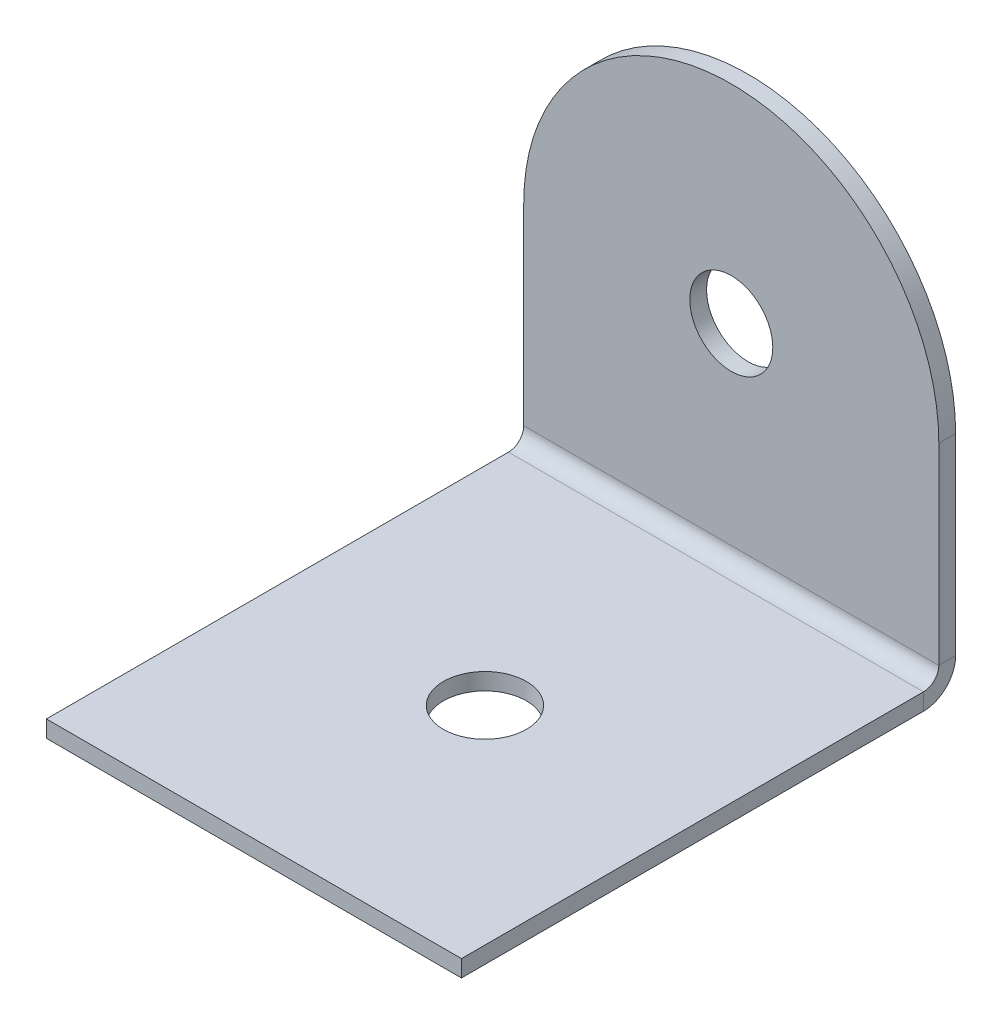
ISO-10303-21;
HEADER;
FILE_DESCRIPTION(('STEP AP214'),'2;1');
FILE_NAME('part.step','',(''),(''),'','','');
FILE_SCHEMA(('AUTOMOTIVE_DESIGN { 1 0 10303 214 1 1 1 1 }'));
ENDSEC;
DATA;
#1=APPLICATION_CONTEXT('core data for automotive mechanical design processes');
#2=APPLICATION_PROTOCOL_DEFINITION('international standard','automotive_design',2000,#1);
#3=PRODUCT_CONTEXT('',#1,'mechanical');
#4=PRODUCT('Part','Part','',(#3));
#5=PRODUCT_RELATED_PRODUCT_CATEGORY('part','',(#4));
#6=PRODUCT_DEFINITION_FORMATION('','',#4);
#7=PRODUCT_DEFINITION_CONTEXT('part definition',#1,'design');
#8=PRODUCT_DEFINITION('design','',#6,#7);
#9=PRODUCT_DEFINITION_SHAPE('','',#8);
#10=(LENGTH_UNIT() NAMED_UNIT(*) SI_UNIT(.MILLI.,.METRE.));
#11=(NAMED_UNIT(*) PLANE_ANGLE_UNIT() SI_UNIT($,.RADIAN.));
#12=(NAMED_UNIT(*) SI_UNIT($,.STERADIAN.) SOLID_ANGLE_UNIT());
#13=UNCERTAINTY_MEASURE_WITH_UNIT(LENGTH_MEASURE(1.E-05),#10,'distance_accuracy_value','');
#14=(GEOMETRIC_REPRESENTATION_CONTEXT(3) GLOBAL_UNCERTAINTY_ASSIGNED_CONTEXT((#13)) GLOBAL_UNIT_ASSIGNED_CONTEXT((#10,
#11,#12)) REPRESENTATION_CONTEXT('',''));
#15=CARTESIAN_POINT('',(0.,0.,0.));
#16=DIRECTION('',(0.,0.,1.));
#17=DIRECTION('',(1.,0.,0.));
#18=AXIS2_PLACEMENT_3D('',#15,#16,#17);
#19=CARTESIAN_POINT('',(20.,0.,-0.81));
#20=DIRECTION('',(1.,0.,0.));
#21=DIRECTION('',(0.,1.,0.));
#22=AXIS2_PLACEMENT_3D('',#19,#20,#21);
#23=PLANE('',#22);
#24=DIRECTION('',(0.,1.,0.));
#25=VECTOR('',#24,1.);
#26=CARTESIAN_POINT('',(20.,0.,0.));
#27=LINE('',#26,#25);
#28=CARTESIAN_POINT('',(20.,0.736599999999997,0.));
#29=VERTEX_POINT('',#28);
#30=CARTESIAN_POINT('',(20.,10.,0.));
#31=VERTEX_POINT('',#30);
#32=EDGE_CURVE('E83',#29,#31,#27,.T.);
#33=ORIENTED_EDGE('',*,*,#32,.F.);
#34=DIRECTION('',(0.,0.,-1.));
#35=VECTOR('',#34,1.);
#36=CARTESIAN_POINT('',(20.,0.736599999999997,0.));
#37=LINE('',#36,#35);
#38=CARTESIAN_POINT('',(20.,0.736599999999997,-0.809999999999999));
#39=VERTEX_POINT('',#38);
#40=EDGE_CURVE('E96',#29,#39,#37,.T.);
#41=ORIENTED_EDGE('',*,*,#40,.T.);
#42=DIRECTION('',(0.,1.,0.));
#43=VECTOR('',#42,1.);
#44=CARTESIAN_POINT('',(20.,0.,-0.81));
#45=LINE('',#44,#43);
#46=CARTESIAN_POINT('',(20.,10.,-0.81));
#47=VERTEX_POINT('',#46);
#48=EDGE_CURVE('E90',#39,#47,#45,.T.);
#49=ORIENTED_EDGE('',*,*,#48,.T.);
#50=DIRECTION('',(0.,0.,1.));
#51=VECTOR('',#50,1.);
#52=CARTESIAN_POINT('',(20.,10.,-0.81));
#53=LINE('',#52,#51);
#54=EDGE_CURVE('E39',#47,#31,#53,.T.);
#55=ORIENTED_EDGE('',*,*,#54,.T.);
#56=EDGE_LOOP('',(#33,#41,#49,#55));
#57=FACE_BOUND('',#56,.T.);
#58=ADVANCED_FACE('F35',(#57),#23,.T.);
#59=CARTESIAN_POINT('',(10.,10.,-0.81));
#60=DIRECTION('',(0.,0.,-1.));
#61=DIRECTION('',(-1.,0.,0.));
#62=AXIS2_PLACEMENT_3D('',#59,#60,#61);
#63=PLANE('',#62);
#64=CARTESIAN_POINT('',(10.,10.,-0.81));
#65=DIRECTION('',(0.,0.,-1.));
#66=DIRECTION('',(-1.,0.,0.));
#67=AXIS2_PLACEMENT_3D('',#64,#65,#66);
#68=CIRCLE('',#67,2.);
#69=CARTESIAN_POINT('',(8.,10.,-0.81));
#70=VERTEX_POINT('',#69);
#71=EDGE_CURVE('E152',#70,#70,#68,.F.);
#72=ORIENTED_EDGE('',*,*,#71,.T.);
#73=EDGE_LOOP('',(#72));
#74=FACE_BOUND('',#73,.T.);
#75=ORIENTED_EDGE('',*,*,#48,.F.);
#76=DIRECTION('',(1.,0.,0.));
#77=VECTOR('',#76,1.);
#78=CARTESIAN_POINT('',(20.,0.736599999999997,-0.809999999999999));
#79=LINE('',#78,#77);
#80=CARTESIAN_POINT('',(0.,0.736600000000002,-0.81));
#81=VERTEX_POINT('',#80);
#82=EDGE_CURVE('E113',#39,#81,#79,.F.);
#83=ORIENTED_EDGE('',*,*,#82,.T.);
#84=DIRECTION('',(0.,-1.,0.));
#85=VECTOR('',#84,1.);
#86=CARTESIAN_POINT('',(0.,0.,-0.81));
#87=LINE('',#86,#85);
#88=CARTESIAN_POINT('',(0.,10.,-0.81));
#89=VERTEX_POINT('',#88);
#90=EDGE_CURVE('E88',#89,#81,#87,.T.);
#91=ORIENTED_EDGE('',*,*,#90,.F.);
#92=CARTESIAN_POINT('',(10.,10.,-0.81));
#93=DIRECTION('',(0.,0.,1.));
#94=DIRECTION('',(-1.,0.,0.));
#95=AXIS2_PLACEMENT_3D('',#92,#93,#94);
#96=CIRCLE('',#95,10.);
#97=EDGE_CURVE('E75',#47,#89,#96,.T.);
#98=ORIENTED_EDGE('',*,*,#97,.F.);
#99=EDGE_LOOP('',(#75,#83,#91,#98));
#100=FACE_BOUND('',#99,.T.);
#101=ADVANCED_FACE('F219',(#74,#100),#63,.T.);
#102=CARTESIAN_POINT('',(10.,10.,0.));
#103=DIRECTION('',(0.,0.,-1.));
#104=DIRECTION('',(-1.,0.,0.));
#105=AXIS2_PLACEMENT_3D('',#102,#103,#104);
#106=PLANE('',#105);
#107=CARTESIAN_POINT('',(10.,10.,0.));
#108=DIRECTION('',(0.,0.,1.));
#109=DIRECTION('',(1.,0.,0.));
#110=AXIS2_PLACEMENT_3D('',#107,#108,#109);
#111=CIRCLE('',#110,2.);
#112=CARTESIAN_POINT('',(12.,10.,0.));
#113=VERTEX_POINT('',#112);
#114=EDGE_CURVE('E147',#113,#113,#111,.T.);
#115=ORIENTED_EDGE('',*,*,#114,.F.);
#116=EDGE_LOOP('',(#115));
#117=FACE_BOUND('',#116,.T.);
#118=DIRECTION('',(1.,0.,0.));
#119=VECTOR('',#118,1.);
#120=CARTESIAN_POINT('',(20.,0.736599999999997,0.));
#121=LINE('',#120,#119);
#122=CARTESIAN_POINT('',(0.,0.736599999999996,0.));
#123=VERTEX_POINT('',#122);
#124=EDGE_CURVE('E103',#29,#123,#121,.F.);
#125=ORIENTED_EDGE('',*,*,#124,.F.);
#126=ORIENTED_EDGE('',*,*,#32,.T.);
#127=CARTESIAN_POINT('',(10.,10.,0.));
#128=DIRECTION('',(0.,0.,1.));
#129=DIRECTION('',(-1.,0.,0.));
#130=AXIS2_PLACEMENT_3D('',#127,#128,#129);
#131=CIRCLE('',#130,10.);
#132=CARTESIAN_POINT('',(0.,10.,0.));
#133=VERTEX_POINT('',#132);
#134=EDGE_CURVE('E73',#31,#133,#131,.T.);
#135=ORIENTED_EDGE('',*,*,#134,.T.);
#136=DIRECTION('',(0.,-1.,0.));
#137=VECTOR('',#136,1.);
#138=CARTESIAN_POINT('',(0.,0.,0.));
#139=LINE('',#138,#137);
#140=EDGE_CURVE('E78',#133,#123,#139,.T.);
#141=ORIENTED_EDGE('',*,*,#140,.T.);
#142=EDGE_LOOP('',(#125,#126,#135,#141));
#143=FACE_BOUND('',#142,.T.);
#144=ADVANCED_FACE('F85',(#117,#143),#106,.F.);
#145=CARTESIAN_POINT('',(0.,0.,-0.81));
#146=DIRECTION('',(-1.,0.,0.));
#147=DIRECTION('',(0.,0.,1.));
#148=AXIS2_PLACEMENT_3D('',#145,#146,#147);
#149=PLANE('',#148);
#150=DIRECTION('',(0.,0.,-1.));
#151=VECTOR('',#150,1.);
#152=CARTESIAN_POINT('',(0.,0.736599999999996,0.));
#153=LINE('',#152,#151);
#154=EDGE_CURVE('E80',#123,#81,#153,.T.);
#155=ORIENTED_EDGE('',*,*,#154,.F.);
#156=ORIENTED_EDGE('',*,*,#140,.F.);
#157=DIRECTION('',(0.,0.,1.));
#158=VECTOR('',#157,1.);
#159=CARTESIAN_POINT('',(0.,10.,-0.81));
#160=LINE('',#159,#158);
#161=EDGE_CURVE('E11',#89,#133,#160,.T.);
#162=ORIENTED_EDGE('',*,*,#161,.F.);
#163=ORIENTED_EDGE('',*,*,#90,.T.);
#164=EDGE_LOOP('',(#155,#156,#162,#163));
#165=FACE_BOUND('',#164,.T.);
#166=ADVANCED_FACE('F37',(#165),#149,.T.);
#167=CARTESIAN_POINT('',(10.,10.,-0.81));
#168=DIRECTION('',(0.,0.,1.));
#169=DIRECTION('',(1.,0.,0.));
#170=AXIS2_PLACEMENT_3D('',#167,#168,#169);
#171=CYLINDRICAL_SURFACE('',#170,10.);
#172=ORIENTED_EDGE('',*,*,#134,.F.);
#173=ORIENTED_EDGE('',*,*,#54,.F.);
#174=ORIENTED_EDGE('',*,*,#97,.T.);
#175=ORIENTED_EDGE('',*,*,#161,.T.);
#176=EDGE_LOOP('',(#172,#173,#174,#175));
#177=FACE_BOUND('',#176,.T.);
#178=ADVANCED_FACE('F70',(#177),#171,.T.);
#179=CARTESIAN_POINT('',(0.,0.736599999999997,0.7366));
#180=DIRECTION('',(-1.,0.,0.));
#181=DIRECTION('',(0.,-1.,0.));
#182=AXIS2_PLACEMENT_3D('',#179,#180,#181);
#183=PLANE('',#182);
#184=DIRECTION('',(0.,-1.,0.));
#185=VECTOR('',#184,1.);
#186=CARTESIAN_POINT('',(0.,0.,0.736599999999997));
#187=LINE('',#186,#185);
#188=CARTESIAN_POINT('',(0.,0.,0.736599999999997));
#189=VERTEX_POINT('',#188);
#190=CARTESIAN_POINT('',(0.,-0.810000000000003,0.736599999999995));
#191=VERTEX_POINT('',#190);
#192=EDGE_CURVE('E143',#189,#191,#187,.T.);
#193=ORIENTED_EDGE('',*,*,#192,.F.);
#194=CARTESIAN_POINT('',(0.,0.736599999999997,0.7366));
#195=DIRECTION('',(1.,0.,0.));
#196=DIRECTION('',(0.,1.,0.));
#197=AXIS2_PLACEMENT_3D('',#194,#195,#196);
#198=CIRCLE('',#197,0.736599999999999);
#199=EDGE_CURVE('E107',#123,#189,#198,.F.);
#200=ORIENTED_EDGE('',*,*,#199,.F.);
#201=ORIENTED_EDGE('',*,*,#154,.T.);
#202=CARTESIAN_POINT('',(0.,0.736599999999997,0.7366));
#203=DIRECTION('',(1.,0.,0.));
#204=DIRECTION('',(0.,1.,0.));
#205=AXIS2_PLACEMENT_3D('',#202,#203,#204);
#206=CIRCLE('',#205,1.5466);
#207=EDGE_CURVE('E50',#81,#191,#206,.F.);
#208=ORIENTED_EDGE('',*,*,#207,.T.);
#209=EDGE_LOOP('',(#193,#200,#201,#208));
#210=FACE_BOUND('',#209,.T.);
#211=ADVANCED_FACE('F222',(#210),#183,.T.);
#212=CARTESIAN_POINT('',(20.,0.736599999999998,0.7366));
#213=DIRECTION('',(-1.,0.,0.));
#214=DIRECTION('',(0.,-1.,0.));
#215=AXIS2_PLACEMENT_3D('',#212,#213,#214);
#216=PLANE('',#215);
#217=CARTESIAN_POINT('',(20.,0.736599999999998,0.7366));
#218=DIRECTION('',(1.,0.,0.));
#219=DIRECTION('',(0.,1.,0.));
#220=AXIS2_PLACEMENT_3D('',#217,#218,#219);
#221=CIRCLE('',#220,0.736599999999999);
#222=CARTESIAN_POINT('',(20.,0.,0.736599999999997));
#223=VERTEX_POINT('',#222);
#224=EDGE_CURVE('E100',#223,#29,#221,.T.);
#225=ORIENTED_EDGE('',*,*,#224,.F.);
#226=DIRECTION('',(0.,-1.,0.));
#227=VECTOR('',#226,1.);
#228=CARTESIAN_POINT('',(20.,0.,0.736599999999997));
#229=LINE('',#228,#227);
#230=CARTESIAN_POINT('',(20.,-0.810000000000003,0.736599999999995));
#231=VERTEX_POINT('',#230);
#232=EDGE_CURVE('E142',#223,#231,#229,.T.);
#233=ORIENTED_EDGE('',*,*,#232,.T.);
#234=CARTESIAN_POINT('',(20.,0.736599999999998,0.7366));
#235=DIRECTION('',(1.,0.,0.));
#236=DIRECTION('',(0.,1.,0.));
#237=AXIS2_PLACEMENT_3D('',#234,#235,#236);
#238=CIRCLE('',#237,1.5466);
#239=EDGE_CURVE('E110',#231,#39,#238,.T.);
#240=ORIENTED_EDGE('',*,*,#239,.T.);
#241=ORIENTED_EDGE('',*,*,#40,.F.);
#242=EDGE_LOOP('',(#225,#233,#240,#241));
#243=FACE_BOUND('',#242,.T.);
#244=ADVANCED_FACE('F211',(#243),#216,.F.);
#245=CARTESIAN_POINT('',(20.,0.736599999999998,0.7366));
#246=DIRECTION('',(1.,0.,0.));
#247=DIRECTION('',(0.,-1.,0.));
#248=AXIS2_PLACEMENT_3D('',#245,#246,#247);
#249=CYLINDRICAL_SURFACE('',#248,1.5466);
#250=ORIENTED_EDGE('',*,*,#82,.F.);
#251=ORIENTED_EDGE('',*,*,#239,.F.);
#252=DIRECTION('',(-1.,0.,0.));
#253=VECTOR('',#252,1.);
#254=CARTESIAN_POINT('',(0.,-0.810000000000003,0.736599999999995));
#255=LINE('',#254,#253);
#256=EDGE_CURVE('E133',#231,#191,#255,.T.);
#257=ORIENTED_EDGE('',*,*,#256,.T.);
#258=ORIENTED_EDGE('',*,*,#207,.F.);
#259=EDGE_LOOP('',(#250,#251,#257,#258));
#260=FACE_BOUND('',#259,.T.);
#261=ADVANCED_FACE('F220',(#260),#249,.T.);
#262=CARTESIAN_POINT('',(20.,0.736599999999998,0.7366));
#263=DIRECTION('',(1.,0.,0.));
#264=DIRECTION('',(0.,-1.,0.));
#265=AXIS2_PLACEMENT_3D('',#262,#263,#264);
#266=CYLINDRICAL_SURFACE('',#265,0.736599999999999);
#267=ORIENTED_EDGE('',*,*,#124,.T.);
#268=ORIENTED_EDGE('',*,*,#199,.T.);
#269=DIRECTION('',(1.,0.,0.));
#270=VECTOR('',#269,1.);
#271=CARTESIAN_POINT('',(0.,0.,0.736599999999997));
#272=LINE('',#271,#270);
#273=EDGE_CURVE('E146',#189,#223,#272,.T.);
#274=ORIENTED_EDGE('',*,*,#273,.T.);
#275=ORIENTED_EDGE('',*,*,#224,.T.);
#276=EDGE_LOOP('',(#267,#268,#274,#275));
#277=FACE_BOUND('',#276,.T.);
#278=ADVANCED_FACE('F216',(#277),#266,.F.);
#279=CARTESIAN_POINT('',(0.,-0.81,0.));
#280=DIRECTION('',(1.,0.,0.));
#281=DIRECTION('',(0.,0.,-1.));
#282=AXIS2_PLACEMENT_3D('',#279,#280,#281);
#283=PLANE('',#282);
#284=ORIENTED_EDGE('',*,*,#192,.T.);
#285=DIRECTION('',(0.,0.,-1.));
#286=VECTOR('',#285,1.);
#287=CARTESIAN_POINT('',(0.,-0.81,0.));
#288=LINE('',#287,#286);
#289=CARTESIAN_POINT('',(0.,-0.81000000000008,23.));
#290=VERTEX_POINT('',#289);
#291=EDGE_CURVE('E126',#290,#191,#288,.T.);
#292=ORIENTED_EDGE('',*,*,#291,.F.);
#293=DIRECTION('',(0.,1.,0.));
#294=VECTOR('',#293,1.);
#295=CARTESIAN_POINT('',(0.,-0.81000000000008,23.));
#296=LINE('',#295,#294);
#297=CARTESIAN_POINT('',(0.,0.,23.));
#298=VERTEX_POINT('',#297);
#299=EDGE_CURVE('E119',#290,#298,#296,.T.);
#300=ORIENTED_EDGE('',*,*,#299,.T.);
#301=DIRECTION('',(0.,0.,-1.));
#302=VECTOR('',#301,1.);
#303=CARTESIAN_POINT('',(0.,0.,0.));
#304=LINE('',#303,#302);
#305=EDGE_CURVE('E130',#298,#189,#304,.T.);
#306=ORIENTED_EDGE('',*,*,#305,.T.);
#307=EDGE_LOOP('',(#284,#292,#300,#306));
#308=FACE_BOUND('',#307,.T.);
#309=ADVANCED_FACE('F224',(#308),#283,.F.);
#310=CARTESIAN_POINT('',(20.,-0.81000000000008,23.));
#311=DIRECTION('',(-1.,0.,0.));
#312=DIRECTION('',(0.,0.,1.));
#313=AXIS2_PLACEMENT_3D('',#310,#311,#312);
#314=PLANE('',#313);
#315=ORIENTED_EDGE('',*,*,#232,.F.);
#316=DIRECTION('',(0.,0.,1.));
#317=VECTOR('',#316,1.);
#318=CARTESIAN_POINT('',(20.,0.,23.));
#319=LINE('',#318,#317);
#320=CARTESIAN_POINT('',(20.,0.,23.));
#321=VERTEX_POINT('',#320);
#322=EDGE_CURVE('E127',#223,#321,#319,.T.);
#323=ORIENTED_EDGE('',*,*,#322,.T.);
#324=DIRECTION('',(0.,1.,0.));
#325=VECTOR('',#324,1.);
#326=CARTESIAN_POINT('',(20.,-0.81000000000008,23.));
#327=LINE('',#326,#325);
#328=CARTESIAN_POINT('',(20.,-0.81000000000008,23.));
#329=VERTEX_POINT('',#328);
#330=EDGE_CURVE('E104',#329,#321,#327,.T.);
#331=ORIENTED_EDGE('',*,*,#330,.F.);
#332=DIRECTION('',(0.,0.,1.));
#333=VECTOR('',#332,1.);
#334=CARTESIAN_POINT('',(20.,-0.81000000000008,23.));
#335=LINE('',#334,#333);
#336=EDGE_CURVE('E136',#231,#329,#335,.T.);
#337=ORIENTED_EDGE('',*,*,#336,.F.);
#338=EDGE_LOOP('',(#315,#323,#331,#337));
#339=FACE_BOUND('',#338,.T.);
#340=ADVANCED_FACE('F184',(#339),#314,.F.);
#341=CARTESIAN_POINT('',(0.,-0.81,0.));
#342=DIRECTION('',(0.,1.,0.));
#343=DIRECTION('',(0.,0.,1.));
#344=AXIS2_PLACEMENT_3D('',#341,#342,#343);
#345=PLANE('',#344);
#346=CARTESIAN_POINT('',(10.,-0.810000000000041,11.87));
#347=DIRECTION('',(0.,1.,0.));
#348=DIRECTION('',(0.,0.,1.));
#349=AXIS2_PLACEMENT_3D('',#346,#347,#348);
#350=CIRCLE('',#349,2.);
#351=CARTESIAN_POINT('',(10.,-0.810000000000048,13.87));
#352=VERTEX_POINT('',#351);
#353=EDGE_CURVE('E155',#352,#352,#350,.F.);
#354=ORIENTED_EDGE('',*,*,#353,.F.);
#355=EDGE_LOOP('',(#354));
#356=FACE_BOUND('',#355,.T.);
#357=ORIENTED_EDGE('',*,*,#256,.F.);
#358=ORIENTED_EDGE('',*,*,#336,.T.);
#359=DIRECTION('',(-1.,0.,0.));
#360=VECTOR('',#359,1.);
#361=CARTESIAN_POINT('',(0.,-0.81000000000008,23.));
#362=LINE('',#361,#360);
#363=EDGE_CURVE('E122',#329,#290,#362,.T.);
#364=ORIENTED_EDGE('',*,*,#363,.T.);
#365=ORIENTED_EDGE('',*,*,#291,.T.);
#366=EDGE_LOOP('',(#357,#358,#364,#365));
#367=FACE_BOUND('',#366,.T.);
#368=ADVANCED_FACE('F171',(#356,#367),#345,.F.);
#369=CARTESIAN_POINT('',(0.,0.,0.));
#370=DIRECTION('',(0.,1.,0.));
#371=DIRECTION('',(0.,0.,1.));
#372=AXIS2_PLACEMENT_3D('',#369,#370,#371);
#373=PLANE('',#372);
#374=CARTESIAN_POINT('',(10.,0.,11.87));
#375=DIRECTION('',(0.,1.,0.));
#376=DIRECTION('',(0.,0.,1.));
#377=AXIS2_PLACEMENT_3D('',#374,#375,#376);
#378=CIRCLE('',#377,2.);
#379=CARTESIAN_POINT('',(10.,0.,13.87));
#380=VERTEX_POINT('',#379);
#381=EDGE_CURVE('E160',#380,#380,#378,.T.);
#382=ORIENTED_EDGE('',*,*,#381,.F.);
#383=EDGE_LOOP('',(#382));
#384=FACE_BOUND('',#383,.T.);
#385=ORIENTED_EDGE('',*,*,#322,.F.);
#386=ORIENTED_EDGE('',*,*,#273,.F.);
#387=ORIENTED_EDGE('',*,*,#305,.F.);
#388=DIRECTION('',(-1.,0.,0.));
#389=VECTOR('',#388,1.);
#390=CARTESIAN_POINT('',(0.,0.,23.));
#391=LINE('',#390,#389);
#392=EDGE_CURVE('E123',#321,#298,#391,.T.);
#393=ORIENTED_EDGE('',*,*,#392,.F.);
#394=EDGE_LOOP('',(#385,#386,#387,#393));
#395=FACE_BOUND('',#394,.T.);
#396=ADVANCED_FACE('F167',(#384,#395),#373,.T.);
#397=CARTESIAN_POINT('',(0.,-0.81000000000008,23.));
#398=DIRECTION('',(0.,0.,-1.));
#399=DIRECTION('',(0.,1.,0.));
#400=AXIS2_PLACEMENT_3D('',#397,#398,#399);
#401=PLANE('',#400);
#402=ORIENTED_EDGE('',*,*,#392,.T.);
#403=ORIENTED_EDGE('',*,*,#299,.F.);
#404=ORIENTED_EDGE('',*,*,#363,.F.);
#405=ORIENTED_EDGE('',*,*,#330,.T.);
#406=EDGE_LOOP('',(#402,#403,#404,#405));
#407=FACE_BOUND('',#406,.T.);
#408=ADVANCED_FACE('F170',(#407),#401,.F.);
#409=CARTESIAN_POINT('',(10.,10.,-0.811));
#410=DIRECTION('',(0.,0.,1.));
#411=DIRECTION('',(1.,0.,0.));
#412=AXIS2_PLACEMENT_3D('',#409,#410,#411);
#413=CYLINDRICAL_SURFACE('',#412,2.);
#414=ORIENTED_EDGE('',*,*,#71,.F.);
#415=EDGE_LOOP('',(#414));
#416=FACE_BOUND('',#415,.T.);
#417=ORIENTED_EDGE('',*,*,#114,.T.);
#418=EDGE_LOOP('',(#417));
#419=FACE_BOUND('',#418,.T.);
#420=ADVANCED_FACE('F282',(#416,#419),#413,.F.);
#421=CARTESIAN_POINT('',(10.,-0.811000000000125,11.87));
#422=DIRECTION('',(0.,1.,0.));
#423=DIRECTION('',(0.,0.,1.));
#424=AXIS2_PLACEMENT_3D('',#421,#422,#423);
#425=CYLINDRICAL_SURFACE('',#424,2.);
#426=CARTESIAN_POINT('',(10.,0.,13.87));
#427=CARTESIAN_POINT('',(10.,-0.00843750000004836,13.87));
#428=CARTESIAN_POINT('',(10.,-0.0168750000000484,13.87));
#429=CARTESIAN_POINT('',(10.,-0.0337500000000484,13.87));
#430=CARTESIAN_POINT('',(10.,-0.0421875000000484,13.87));
#431=CARTESIAN_POINT('',(10.,-0.0590625000000484,13.87));
#432=CARTESIAN_POINT('',(10.,-0.0675000000000484,13.87));
#433=CARTESIAN_POINT('',(10.,-0.0843750000000484,13.87));
#434=CARTESIAN_POINT('',(10.,-0.0928125000000484,13.87));
#435=CARTESIAN_POINT('',(10.,-0.109687500000048,13.87));
#436=CARTESIAN_POINT('',(10.,-0.118125000000048,13.87));
#437=CARTESIAN_POINT('',(10.,-0.135000000000048,13.87));
#438=CARTESIAN_POINT('',(10.,-0.143437500000048,13.87));
#439=CARTESIAN_POINT('',(10.,-0.160312500000048,13.87));
#440=CARTESIAN_POINT('',(10.,-0.168750000000048,13.87));
#441=CARTESIAN_POINT('',(10.,-0.185625000000048,13.87));
#442=CARTESIAN_POINT('',(10.,-0.194062500000048,13.87));
#443=CARTESIAN_POINT('',(10.,-0.210937500000048,13.87));
#444=CARTESIAN_POINT('',(10.,-0.219375000000048,13.87));
#445=CARTESIAN_POINT('',(10.,-0.236250000000048,13.87));
#446=CARTESIAN_POINT('',(10.,-0.244687500000048,13.87));
#447=CARTESIAN_POINT('',(10.,-0.261562500000048,13.87));
#448=CARTESIAN_POINT('',(10.,-0.270000000000048,13.87));
#449=CARTESIAN_POINT('',(10.,-0.286875000000048,13.87));
#450=CARTESIAN_POINT('',(10.,-0.295312500000048,13.87));
#451=CARTESIAN_POINT('',(10.,-0.312187500000048,13.87));
#452=CARTESIAN_POINT('',(10.,-0.320625000000048,13.87));
#453=CARTESIAN_POINT('',(10.,-0.337500000000048,13.87));
#454=CARTESIAN_POINT('',(10.,-0.345937500000048,13.87));
#455=CARTESIAN_POINT('',(10.,-0.362812500000048,13.87));
#456=CARTESIAN_POINT('',(10.,-0.371250000000048,13.87));
#457=CARTESIAN_POINT('',(10.,-0.388125000000048,13.87));
#458=CARTESIAN_POINT('',(10.,-0.396562500000048,13.87));
#459=CARTESIAN_POINT('',(10.,-0.413437500000048,13.87));
#460=CARTESIAN_POINT('',(10.,-0.421875000000048,13.87));
#461=CARTESIAN_POINT('',(10.,-0.438750000000048,13.87));
#462=CARTESIAN_POINT('',(10.,-0.447187500000048,13.87));
#463=CARTESIAN_POINT('',(10.,-0.464062500000048,13.87));
#464=CARTESIAN_POINT('',(10.,-0.472500000000048,13.87));
#465=CARTESIAN_POINT('',(10.,-0.489375000000048,13.87));
#466=CARTESIAN_POINT('',(10.,-0.497812500000048,13.87));
#467=CARTESIAN_POINT('',(10.,-0.514687500000048,13.87));
#468=CARTESIAN_POINT('',(10.,-0.523125000000048,13.87));
#469=CARTESIAN_POINT('',(10.,-0.540000000000048,13.87));
#470=CARTESIAN_POINT('',(10.,-0.548437500000048,13.87));
#471=CARTESIAN_POINT('',(10.,-0.565312500000048,13.87));
#472=CARTESIAN_POINT('',(10.,-0.573750000000048,13.87));
#473=CARTESIAN_POINT('',(10.,-0.590625000000048,13.87));
#474=CARTESIAN_POINT('',(10.,-0.599062500000048,13.87));
#475=CARTESIAN_POINT('',(10.,-0.615937500000048,13.87));
#476=CARTESIAN_POINT('',(10.,-0.624375000000048,13.87));
#477=CARTESIAN_POINT('',(10.,-0.641250000000048,13.87));
#478=CARTESIAN_POINT('',(10.,-0.649687500000048,13.87));
#479=CARTESIAN_POINT('',(10.,-0.666562500000048,13.87));
#480=CARTESIAN_POINT('',(10.,-0.675000000000048,13.87));
#481=CARTESIAN_POINT('',(10.,-0.691875000000048,13.87));
#482=CARTESIAN_POINT('',(10.,-0.700312500000048,13.87));
#483=CARTESIAN_POINT('',(10.,-0.717187500000048,13.87));
#484=CARTESIAN_POINT('',(10.,-0.725625000000048,13.87));
#485=CARTESIAN_POINT('',(10.,-0.742500000000048,13.87));
#486=CARTESIAN_POINT('',(10.,-0.750937500000048,13.87));
#487=CARTESIAN_POINT('',(10.,-0.767812500000048,13.87));
#488=CARTESIAN_POINT('',(10.,-0.776250000000048,13.87));
#489=CARTESIAN_POINT('',(10.,-0.793125000000048,13.87));
#490=CARTESIAN_POINT('',(10.,-0.801562500000048,13.87));
#491=CARTESIAN_POINT('',(10.,-0.810000000000048,13.87));
#492=B_SPLINE_CURVE_WITH_KNOTS('',3,(#426,#427,#428,#429,#430,#431,#432,#433,#434,#435,#436,
#437,#438,#439,#440,#441,#442,#443,#444,#445,#446,#447,#448,#449,#450,#451,#452,#453,#454,#455,
#456,#457,#458,#459,#460,#461,#462,#463,#464,#465,#466,#467,#468,#469,#470,#471,#472,#473,#474,
#475,#476,#477,#478,#479,#480,#481,#482,#483,#484,#485,#486,#487,#488,#489,#490,#491),
.UNSPECIFIED.,.F.,.F.,(4,2,2,2,2,2,2,2,2,2,2,2,2,2,2,2,2,2,2,2,2,2,2,2,2,2,2,2,2,2,2,2,4),(0.,
0.0253125000000001,0.050625,0.0759375,0.10125,0.1265625,0.151875,0.1771875,0.2025,0.2278125,
0.253125,0.2784375,0.30375,0.3290625,0.354375,0.3796875,0.405,0.4303125,0.455625,0.4809375,
0.50625,0.5315625,0.556875,0.5821875,0.6075,0.6328125,0.658125,0.6834375,0.70875,0.7340625,
0.759375,0.7846875,0.81),.UNSPECIFIED.);
#493=EDGE_CURVE('BSEAM164',#380,#352,#492,.T.);
#494=ORIENTED_EDGE('',*,*,#381,.T.);
#495=ORIENTED_EDGE('',*,*,#353,.T.);
#496=ORIENTED_EDGE('',*,*,#493,.T.);
#497=ORIENTED_EDGE('',*,*,#493,.F.);
#498=EDGE_LOOP('',(#494,#496,#495,#497));
#499=FACE_BOUND('',#498,.T.);
#500=ADVANCED_FACE('F164',(#499),#425,.F.);
#501=CLOSED_SHELL('',(#58,#101,#144,#166,#178,#211,#244,#261,#278,#309,#340,#368,#396,#408,#420,#500));
#502=MANIFOLD_SOLID_BREP('B2',#501);
#503=ADVANCED_BREP_SHAPE_REPRESENTATION('',(#18,#502),#14);
#504=SHAPE_DEFINITION_REPRESENTATION(#9,#503);
ENDSEC;
END-ISO-10303-21;
